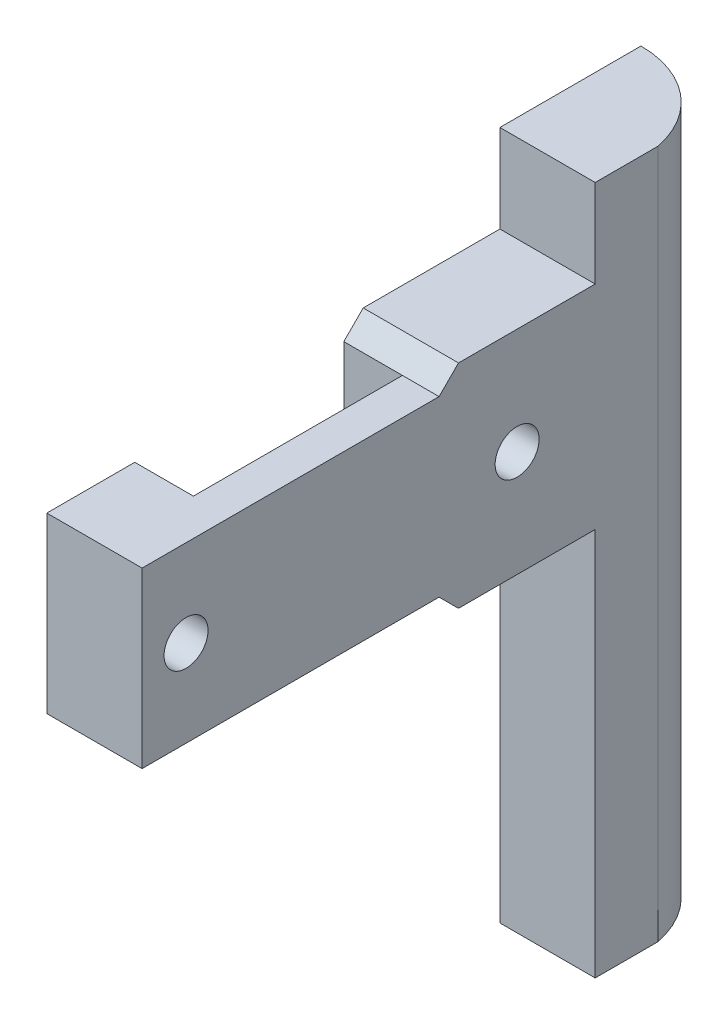
ISO-10303-21;
HEADER;
FILE_DESCRIPTION(('STEP AP214'),'2;1');
FILE_NAME('part.step','',(''),(''),'','','');
FILE_SCHEMA(('AUTOMOTIVE_DESIGN { 1 0 10303 214 1 1 1 1 }'));
ENDSEC;
DATA;
#1=APPLICATION_CONTEXT('core data for automotive mechanical design processes');
#2=APPLICATION_PROTOCOL_DEFINITION('international standard','automotive_design',2000,#1);
#3=PRODUCT_CONTEXT('',#1,'mechanical');
#4=PRODUCT('Part','Part','',(#3));
#5=PRODUCT_RELATED_PRODUCT_CATEGORY('part','',(#4));
#6=PRODUCT_DEFINITION_FORMATION('','',#4);
#7=PRODUCT_DEFINITION_CONTEXT('part definition',#1,'design');
#8=PRODUCT_DEFINITION('design','',#6,#7);
#9=PRODUCT_DEFINITION_SHAPE('','',#8);
#10=(LENGTH_UNIT() NAMED_UNIT(*) SI_UNIT(.MILLI.,.METRE.));
#11=(NAMED_UNIT(*) PLANE_ANGLE_UNIT() SI_UNIT($,.RADIAN.));
#12=(NAMED_UNIT(*) SI_UNIT($,.STERADIAN.) SOLID_ANGLE_UNIT());
#13=UNCERTAINTY_MEASURE_WITH_UNIT(LENGTH_MEASURE(1.E-05),#10,'distance_accuracy_value','');
#14=(GEOMETRIC_REPRESENTATION_CONTEXT(3) GLOBAL_UNCERTAINTY_ASSIGNED_CONTEXT((#13)) GLOBAL_UNIT_ASSIGNED_CONTEXT((#10,
#11,#12)) REPRESENTATION_CONTEXT('',''));
#15=CARTESIAN_POINT('',(0.,0.,0.));
#16=DIRECTION('',(0.,0.,1.));
#17=DIRECTION('',(1.,0.,0.));
#18=AXIS2_PLACEMENT_3D('',#15,#16,#17);
#19=CARTESIAN_POINT('',(12.87,26.5,-16.65));
#20=DIRECTION('',(0.,-1.,0.));
#21=DIRECTION('',(0.,0.,-1.));
#22=AXIS2_PLACEMENT_3D('',#19,#20,#21);
#23=CYLINDRICAL_SURFACE('',#22,13.25);
#24=CARTESIAN_POINT('',(12.87,-67.5,-16.65));
#25=DIRECTION('',(0.,-1.,0.));
#26=DIRECTION('',(0.,0.,-1.));
#27=AXIS2_PLACEMENT_3D('',#24,#25,#26);
#28=CIRCLE('',#27,13.25);
#29=CARTESIAN_POINT('',(12.87,-67.5,-29.9));
#30=VERTEX_POINT('',#29);
#31=CARTESIAN_POINT('',(25.87,-67.5,-19.2117376914899));
#32=VERTEX_POINT('',#31);
#33=EDGE_CURVE('E172',#30,#32,#28,.T.);
#34=ORIENTED_EDGE('',*,*,#33,.F.);
#35=DIRECTION('',(0.,1.,0.));
#36=VECTOR('',#35,1.);
#37=CARTESIAN_POINT('',(12.87,69.9983495705505,-29.9));
#38=LINE('',#37,#36);
#39=CARTESIAN_POINT('',(12.87,26.5,-29.9));
#40=VERTEX_POINT('',#39);
#41=EDGE_CURVE('E154',#30,#40,#38,.T.);
#42=ORIENTED_EDGE('',*,*,#41,.T.);
#43=CARTESIAN_POINT('',(12.87,26.5,-16.65));
#44=DIRECTION('',(0.,-1.,0.));
#45=DIRECTION('',(0.,0.,-1.));
#46=AXIS2_PLACEMENT_3D('',#43,#44,#45);
#47=CIRCLE('',#46,13.25);
#48=CARTESIAN_POINT('',(25.87,26.5,-19.2117376914899));
#49=VERTEX_POINT('',#48);
#50=EDGE_CURVE('E178',#40,#49,#47,.T.);
#51=ORIENTED_EDGE('',*,*,#50,.T.);
#52=DIRECTION('',(0.,-1.,0.));
#53=VECTOR('',#52,1.);
#54=CARTESIAN_POINT('',(25.87,26.5,-19.2117376914899));
#55=LINE('',#54,#53);
#56=EDGE_CURVE('E180',#49,#32,#55,.T.);
#57=ORIENTED_EDGE('',*,*,#56,.T.);
#58=EDGE_LOOP('',(#34,#42,#51,#57));
#59=FACE_BOUND('',#58,.T.);
#60=ADVANCED_FACE('F35',(#59),#23,.T.);
#61=CARTESIAN_POINT('',(25.87,0.,0.));
#62=DIRECTION('',(-1.,0.,0.));
#63=DIRECTION('',(0.,0.,1.));
#64=AXIS2_PLACEMENT_3D('',#61,#62,#63);
#65=PLANE('',#64);
#66=CARTESIAN_POINT('',(25.87,0.,45.17));
#67=DIRECTION('',(1.,0.,0.));
#68=DIRECTION('',(0.,0.,-1.));
#69=AXIS2_PLACEMENT_3D('',#66,#67,#68);
#70=CIRCLE('',#69,3.);
#71=CARTESIAN_POINT('',(25.87,0.,42.17));
#72=VERTEX_POINT('',#71);
#73=EDGE_CURVE('E272',#72,#72,#70,.T.);
#74=ORIENTED_EDGE('',*,*,#73,.F.);
#75=EDGE_LOOP('',(#74));
#76=FACE_BOUND('',#75,.T.);
#77=CARTESIAN_POINT('',(25.87,0.,0.));
#78=DIRECTION('',(1.,0.,0.));
#79=DIRECTION('',(0.,0.,-1.));
#80=AXIS2_PLACEMENT_3D('',#77,#78,#79);
#81=CIRCLE('',#80,3.);
#82=CARTESIAN_POINT('',(25.87,0.,-3.));
#83=VERTEX_POINT('',#82);
#84=EDGE_CURVE('E174',#83,#83,#81,.T.);
#85=ORIENTED_EDGE('',*,*,#84,.F.);
#86=EDGE_LOOP('',(#85));
#87=FACE_BOUND('',#86,.T.);
#88=ORIENTED_EDGE('',*,*,#56,.F.);
#89=DIRECTION('',(0.,0.,1.));
#90=VECTOR('',#89,1.);
#91=CARTESIAN_POINT('',(25.87,26.5,-30.65));
#92=LINE('',#91,#90);
#93=CARTESIAN_POINT('',(25.87,26.5,-10.65));
#94=VERTEX_POINT('',#93);
#95=EDGE_CURVE('E193',#49,#94,#92,.T.);
#96=ORIENTED_EDGE('',*,*,#95,.T.);
#97=DIRECTION('',(0.,-1.,0.));
#98=VECTOR('',#97,1.);
#99=CARTESIAN_POINT('',(25.87,26.5,-10.65));
#100=LINE('',#99,#98);
#101=CARTESIAN_POINT('',(25.87,14.5,-10.65));
#102=VERTEX_POINT('',#101);
#103=EDGE_CURVE('E185',#94,#102,#100,.T.);
#104=ORIENTED_EDGE('',*,*,#103,.T.);
#105=DIRECTION('',(0.,0.,1.));
#106=VECTOR('',#105,1.);
#107=CARTESIAN_POINT('',(25.87,14.5,-10.65));
#108=LINE('',#107,#106);
#109=CARTESIAN_POINT('',(25.87,14.5,7.99834957055046));
#110=VERTEX_POINT('',#109);
#111=EDGE_CURVE('E242',#102,#110,#108,.T.);
#112=ORIENTED_EDGE('',*,*,#111,.T.);
#113=DIRECTION('',(0.,-0.707106781186551,0.707106781186544));
#114=VECTOR('',#113,1.);
#115=CARTESIAN_POINT('',(25.87,14.5,7.99834957055046));
#116=LINE('',#115,#114);
#117=CARTESIAN_POINT('',(25.87,11.8483495705504,10.65));
#118=VERTEX_POINT('',#117);
#119=EDGE_CURVE('E230',#110,#118,#116,.T.);
#120=ORIENTED_EDGE('',*,*,#119,.T.);
#121=DIRECTION('',(0.,0.,-1.));
#122=VECTOR('',#121,1.);
#123=CARTESIAN_POINT('',(25.87,11.8483495705504,44.17));
#124=LINE('',#123,#122);
#125=CARTESIAN_POINT('',(25.87,11.8483495705504,51.17));
#126=VERTEX_POINT('',#125);
#127=EDGE_CURVE('E219',#126,#118,#124,.T.);
#128=ORIENTED_EDGE('',*,*,#127,.F.);
#129=DIRECTION('',(0.,1.,0.));
#130=VECTOR('',#129,1.);
#131=CARTESIAN_POINT('',(25.87,11.8483495705504,51.17));
#132=LINE('',#131,#130);
#133=CARTESIAN_POINT('',(25.87,-11.8516504294496,51.17));
#134=VERTEX_POINT('',#133);
#135=EDGE_CURVE('E169',#134,#126,#132,.T.);
#136=ORIENTED_EDGE('',*,*,#135,.F.);
#137=DIRECTION('',(0.,0.,-1.));
#138=VECTOR('',#137,1.);
#139=CARTESIAN_POINT('',(25.87,-11.8516504294496,44.17));
#140=LINE('',#139,#138);
#141=CARTESIAN_POINT('',(25.87,-11.8516504294496,10.65));
#142=VERTEX_POINT('',#141);
#143=EDGE_CURVE('E221',#134,#142,#140,.T.);
#144=ORIENTED_EDGE('',*,*,#143,.T.);
#145=DIRECTION('',(0.,1.,0.));
#146=VECTOR('',#145,1.);
#147=CARTESIAN_POINT('',(25.87,11.8483495705504,10.65));
#148=LINE('',#147,#146);
#149=CARTESIAN_POINT('',(25.87,-11.8483495705504,10.65));
#150=VERTEX_POINT('',#149);
#151=EDGE_CURVE('E210',#142,#150,#148,.T.);
#152=ORIENTED_EDGE('',*,*,#151,.T.);
#153=DIRECTION('',(0.,0.707106781186551,0.707106781186544));
#154=VECTOR('',#153,1.);
#155=CARTESIAN_POINT('',(25.87,-11.2491747852751,11.2491747852753));
#156=LINE('',#155,#154);
#157=CARTESIAN_POINT('',(25.87,-14.5,7.99834957055045));
#158=VERTEX_POINT('',#157);
#159=EDGE_CURVE('E227',#158,#150,#156,.T.);
#160=ORIENTED_EDGE('',*,*,#159,.F.);
#161=DIRECTION('',(0.,0.,-1.));
#162=VECTOR('',#161,1.);
#163=CARTESIAN_POINT('',(25.87,-14.5,-10.65));
#164=LINE('',#163,#162);
#165=CARTESIAN_POINT('',(25.87,-14.5,-10.65));
#166=VERTEX_POINT('',#165);
#167=EDGE_CURVE('E233',#158,#166,#164,.T.);
#168=ORIENTED_EDGE('',*,*,#167,.T.);
#169=CARTESIAN_POINT('',(25.87,-67.5,-10.65));
#170=VERTEX_POINT('',#169);
#171=EDGE_CURVE('E184',#166,#170,#100,.T.);
#172=ORIENTED_EDGE('',*,*,#171,.T.);
#173=DIRECTION('',(0.,0.,1.));
#174=VECTOR('',#173,1.);
#175=CARTESIAN_POINT('',(25.87,-67.5,-30.65));
#176=LINE('',#175,#174);
#177=EDGE_CURVE('E196',#32,#170,#176,.T.);
#178=ORIENTED_EDGE('',*,*,#177,.F.);
#179=EDGE_LOOP('',(#88,#96,#104,#112,#120,#128,#136,#144,#152,#160,#168,#172,#178));
#180=FACE_BOUND('',#179,.T.);
#181=ADVANCED_FACE('F260',(#76,#87,#180),#65,.F.);
#182=CARTESIAN_POINT('',(0.,-67.5,-30.65));
#183=DIRECTION('',(0.,1.,0.));
#184=DIRECTION('',(0.,0.,1.));
#185=AXIS2_PLACEMENT_3D('',#182,#183,#184);
#186=PLANE('',#185);
#187=DIRECTION('',(-1.,0.,0.));
#188=VECTOR('',#187,1.);
#189=CARTESIAN_POINT('',(0.,-67.5,-10.65));
#190=LINE('',#189,#188);
#191=CARTESIAN_POINT('',(12.87,-67.5,-10.65));
#192=VERTEX_POINT('',#191);
#193=EDGE_CURVE('E188',#170,#192,#190,.T.);
#194=ORIENTED_EDGE('',*,*,#193,.T.);
#195=DIRECTION('',(0.,0.,-1.));
#196=VECTOR('',#195,1.);
#197=CARTESIAN_POINT('',(12.87,-67.5,-30.65));
#198=LINE('',#197,#196);
#199=EDGE_CURVE('E334',#192,#30,#198,.T.);
#200=ORIENTED_EDGE('',*,*,#199,.T.);
#201=ORIENTED_EDGE('',*,*,#33,.T.);
#202=ORIENTED_EDGE('',*,*,#177,.T.);
#203=EDGE_LOOP('',(#194,#200,#201,#202));
#204=FACE_BOUND('',#203,.T.);
#205=ADVANCED_FACE('F280',(#204),#186,.F.);
#206=CARTESIAN_POINT('',(0.,26.5,-30.65));
#207=DIRECTION('',(0.,-1.,0.));
#208=DIRECTION('',(1.,0.,0.));
#209=AXIS2_PLACEMENT_3D('',#206,#207,#208);
#210=PLANE('',#209);
#211=ORIENTED_EDGE('',*,*,#50,.F.);
#212=DIRECTION('',(0.,0.,1.));
#213=VECTOR('',#212,1.);
#214=CARTESIAN_POINT('',(12.87,26.5,-30.65));
#215=LINE('',#214,#213);
#216=CARTESIAN_POINT('',(12.87,26.5,-10.65));
#217=VERTEX_POINT('',#216);
#218=EDGE_CURVE('E51',#40,#217,#215,.T.);
#219=ORIENTED_EDGE('',*,*,#218,.T.);
#220=DIRECTION('',(1.,0.,0.));
#221=VECTOR('',#220,1.);
#222=CARTESIAN_POINT('',(0.,26.5,-10.65));
#223=LINE('',#222,#221);
#224=EDGE_CURVE('E191',#217,#94,#223,.T.);
#225=ORIENTED_EDGE('',*,*,#224,.T.);
#226=ORIENTED_EDGE('',*,*,#95,.F.);
#227=EDGE_LOOP('',(#211,#219,#225,#226));
#228=FACE_BOUND('',#227,.T.);
#229=ADVANCED_FACE('F265',(#228),#210,.F.);
#230=CARTESIAN_POINT('',(20.87,11.8483495705504,44.17));
#231=DIRECTION('',(1.,0.,0.));
#232=DIRECTION('',(0.,1.,0.));
#233=AXIS2_PLACEMENT_3D('',#230,#231,#232);
#234=PLANE('',#233);
#235=DIRECTION('',(0.,-1.,0.));
#236=VECTOR('',#235,1.);
#237=CARTESIAN_POINT('',(20.87,11.8483495705504,39.17));
#238=LINE('',#237,#236);
#239=CARTESIAN_POINT('',(20.87,11.8483495705504,39.17));
#240=VERTEX_POINT('',#239);
#241=CARTESIAN_POINT('',(20.87,-11.8516504294496,39.17));
#242=VERTEX_POINT('',#241);
#243=EDGE_CURVE('E198',#240,#242,#238,.T.);
#244=ORIENTED_EDGE('',*,*,#243,.F.);
#245=DIRECTION('',(0.,0.,-1.));
#246=VECTOR('',#245,1.);
#247=CARTESIAN_POINT('',(20.87,11.8483495705504,44.17));
#248=LINE('',#247,#246);
#249=CARTESIAN_POINT('',(20.87,11.8483495705504,10.65));
#250=VERTEX_POINT('',#249);
#251=EDGE_CURVE('E216',#240,#250,#248,.T.);
#252=ORIENTED_EDGE('',*,*,#251,.T.);
#253=DIRECTION('',(0.,-1.,0.));
#254=VECTOR('',#253,1.);
#255=CARTESIAN_POINT('',(20.87,11.8483495705504,10.65));
#256=LINE('',#255,#254);
#257=CARTESIAN_POINT('',(20.87,-11.8483495705504,10.65));
#258=VERTEX_POINT('',#257);
#259=EDGE_CURVE('E205',#250,#258,#256,.T.);
#260=ORIENTED_EDGE('',*,*,#259,.T.);
#261=CARTESIAN_POINT('',(20.87,-11.8516504294496,10.65));
#262=VERTEX_POINT('',#261);
#263=EDGE_CURVE('E204',#258,#262,#256,.T.);
#264=ORIENTED_EDGE('',*,*,#263,.T.);
#265=DIRECTION('',(0.,0.,-1.));
#266=VECTOR('',#265,1.);
#267=CARTESIAN_POINT('',(20.87,-11.8516504294496,44.17));
#268=LINE('',#267,#266);
#269=EDGE_CURVE('E224',#242,#262,#268,.T.);
#270=ORIENTED_EDGE('',*,*,#269,.F.);
#271=EDGE_LOOP('',(#244,#252,#260,#264,#270));
#272=FACE_BOUND('',#271,.T.);
#273=ADVANCED_FACE('F372',(#272),#234,.F.);
#274=CARTESIAN_POINT('',(25.87,14.5,10.65));
#275=DIRECTION('',(0.,0.,-1.));
#276=DIRECTION('',(0.,1.,0.));
#277=AXIS2_PLACEMENT_3D('',#274,#275,#276);
#278=PLANE('',#277);
#279=DIRECTION('',(1.,0.,0.));
#280=VECTOR('',#279,1.);
#281=CARTESIAN_POINT('',(0.,11.8483495705504,10.65));
#282=LINE('',#281,#280);
#283=CARTESIAN_POINT('',(12.87,11.8483495705504,10.65));
#284=VERTEX_POINT('',#283);
#285=EDGE_CURVE('E226',#284,#250,#282,.T.);
#286=ORIENTED_EDGE('',*,*,#285,.F.);
#287=DIRECTION('',(0.,-1.,0.));
#288=VECTOR('',#287,1.);
#289=CARTESIAN_POINT('',(12.87,14.5,10.65));
#290=LINE('',#289,#288);
#291=CARTESIAN_POINT('',(12.87,-11.8483495705504,10.65));
#292=VERTEX_POINT('',#291);
#293=EDGE_CURVE('E329',#284,#292,#290,.T.);
#294=ORIENTED_EDGE('',*,*,#293,.T.);
#295=DIRECTION('',(1.,0.,0.));
#296=VECTOR('',#295,1.);
#297=CARTESIAN_POINT('',(0.,-11.8483495705504,10.65));
#298=LINE('',#297,#296);
#299=EDGE_CURVE('E231',#292,#258,#298,.T.);
#300=ORIENTED_EDGE('',*,*,#299,.T.);
#301=ORIENTED_EDGE('',*,*,#259,.F.);
#302=EDGE_LOOP('',(#286,#294,#300,#301));
#303=FACE_BOUND('',#302,.T.);
#304=ADVANCED_FACE('F37',(#303),#278,.F.);
#305=CARTESIAN_POINT('',(25.87,14.5,-10.65));
#306=DIRECTION('',(0.,-1.,0.));
#307=DIRECTION('',(0.,0.,-1.));
#308=AXIS2_PLACEMENT_3D('',#305,#306,#307);
#309=PLANE('',#308);
#310=DIRECTION('',(-1.,0.,0.));
#311=VECTOR('',#310,1.);
#312=CARTESIAN_POINT('',(25.87,14.5,-10.65));
#313=LINE('',#312,#311);
#314=CARTESIAN_POINT('',(12.87,14.5,-10.65));
#315=VERTEX_POINT('',#314);
#316=EDGE_CURVE('E44',#102,#315,#313,.T.);
#317=ORIENTED_EDGE('',*,*,#316,.T.);
#318=DIRECTION('',(0.,0.,1.));
#319=VECTOR('',#318,1.);
#320=CARTESIAN_POINT('',(12.87,14.5,-10.65));
#321=LINE('',#320,#319);
#322=CARTESIAN_POINT('',(12.87,14.5,7.99834957055046));
#323=VERTEX_POINT('',#322);
#324=EDGE_CURVE('E250',#315,#323,#321,.T.);
#325=ORIENTED_EDGE('',*,*,#324,.T.);
#326=DIRECTION('',(1.,0.,0.));
#327=VECTOR('',#326,1.);
#328=CARTESIAN_POINT('',(0.,14.5,7.99834957055046));
#329=LINE('',#328,#327);
#330=EDGE_CURVE('E237',#323,#110,#329,.T.);
#331=ORIENTED_EDGE('',*,*,#330,.T.);
#332=ORIENTED_EDGE('',*,*,#111,.F.);
#333=EDGE_LOOP('',(#317,#325,#331,#332));
#334=FACE_BOUND('',#333,.T.);
#335=ADVANCED_FACE('F249',(#334),#309,.F.);
#336=CARTESIAN_POINT('',(25.87,-14.5,-10.65));
#337=DIRECTION('',(0.,1.,0.));
#338=DIRECTION('',(0.,0.,1.));
#339=AXIS2_PLACEMENT_3D('',#336,#337,#338);
#340=PLANE('',#339);
#341=DIRECTION('',(1.,0.,0.));
#342=VECTOR('',#341,1.);
#343=CARTESIAN_POINT('',(0.,-14.5,7.99834957055045));
#344=LINE('',#343,#342);
#345=CARTESIAN_POINT('',(12.87,-14.5,7.99834957055044));
#346=VERTEX_POINT('',#345);
#347=EDGE_CURVE('E229',#346,#158,#344,.T.);
#348=ORIENTED_EDGE('',*,*,#347,.F.);
#349=DIRECTION('',(0.,0.,-1.));
#350=VECTOR('',#349,1.);
#351=CARTESIAN_POINT('',(12.87,-14.5,-10.65));
#352=LINE('',#351,#350);
#353=CARTESIAN_POINT('',(12.87,-14.5,-10.65));
#354=VERTEX_POINT('',#353);
#355=EDGE_CURVE('E309',#346,#354,#352,.T.);
#356=ORIENTED_EDGE('',*,*,#355,.T.);
#357=DIRECTION('',(-1.,0.,0.));
#358=VECTOR('',#357,1.);
#359=CARTESIAN_POINT('',(25.87,-14.5,-10.65));
#360=LINE('',#359,#358);
#361=EDGE_CURVE('E11',#166,#354,#360,.T.);
#362=ORIENTED_EDGE('',*,*,#361,.F.);
#363=ORIENTED_EDGE('',*,*,#167,.F.);
#364=EDGE_LOOP('',(#348,#356,#362,#363));
#365=FACE_BOUND('',#364,.T.);
#366=ADVANCED_FACE('F297',(#365),#340,.F.);
#367=CARTESIAN_POINT('',(0.,14.5,7.99834957055046));
#368=DIRECTION('',(0.,0.707106781186544,0.707106781186551));
#369=DIRECTION('',(0.,-0.707106781186551,0.707106781186544));
#370=AXIS2_PLACEMENT_3D('',#367,#368,#369);
#371=PLANE('',#370);
#372=DIRECTION('',(0.,0.707106781186551,-0.707106781186544));
#373=VECTOR('',#372,1.);
#374=CARTESIAN_POINT('',(12.87,14.5,7.99834957055046));
#375=LINE('',#374,#373);
#376=EDGE_CURVE('E331',#284,#323,#375,.T.);
#377=ORIENTED_EDGE('',*,*,#376,.F.);
#378=ORIENTED_EDGE('',*,*,#285,.T.);
#379=DIRECTION('',(-1.,0.,0.));
#380=VECTOR('',#379,1.);
#381=CARTESIAN_POINT('',(25.87,11.8483495705504,10.65));
#382=LINE('',#381,#380);
#383=EDGE_CURVE('E213',#118,#250,#382,.T.);
#384=ORIENTED_EDGE('',*,*,#383,.F.);
#385=ORIENTED_EDGE('',*,*,#119,.F.);
#386=ORIENTED_EDGE('',*,*,#330,.F.);
#387=EDGE_LOOP('',(#377,#378,#384,#385,#386));
#388=FACE_BOUND('',#387,.T.);
#389=ADVANCED_FACE('F294',(#388),#371,.T.);
#390=CARTESIAN_POINT('',(0.,-11.2491747852751,11.2491747852753));
#391=DIRECTION('',(0.,0.707106781186544,-0.707106781186551));
#392=DIRECTION('',(0.,0.707106781186551,0.707106781186544));
#393=AXIS2_PLACEMENT_3D('',#390,#391,#392);
#394=PLANE('',#393);
#395=ORIENTED_EDGE('',*,*,#299,.F.);
#396=DIRECTION('',(0.,-0.707106781186551,-0.707106781186544));
#397=VECTOR('',#396,1.);
#398=CARTESIAN_POINT('',(12.87,-11.2491747852751,11.2491747852753));
#399=LINE('',#398,#397);
#400=EDGE_CURVE('E316',#292,#346,#399,.T.);
#401=ORIENTED_EDGE('',*,*,#400,.T.);
#402=ORIENTED_EDGE('',*,*,#347,.T.);
#403=ORIENTED_EDGE('',*,*,#159,.T.);
#404=EDGE_CURVE('E234',#258,#150,#298,.T.);
#405=ORIENTED_EDGE('',*,*,#404,.F.);
#406=EDGE_LOOP('',(#395,#401,#402,#403,#405));
#407=FACE_BOUND('',#406,.T.);
#408=ADVANCED_FACE('F303',(#407),#394,.F.);
#409=CARTESIAN_POINT('',(25.87,-11.8516504294496,44.17));
#410=DIRECTION('',(0.,1.,0.));
#411=DIRECTION('',(0.,0.,1.));
#412=AXIS2_PLACEMENT_3D('',#409,#410,#411);
#413=PLANE('',#412);
#414=DIRECTION('',(1.,0.,0.));
#415=VECTOR('',#414,1.);
#416=CARTESIAN_POINT('',(25.87,-11.8516504294496,51.17));
#417=LINE('',#416,#415);
#418=CARTESIAN_POINT('',(12.87,-11.8516504294496,51.17));
#419=VERTEX_POINT('',#418);
#420=EDGE_CURVE('E170',#419,#134,#417,.T.);
#421=ORIENTED_EDGE('',*,*,#420,.F.);
#422=DIRECTION('',(0.,0.,-1.));
#423=VECTOR('',#422,1.);
#424=CARTESIAN_POINT('',(12.87,-11.8516504294496,44.17));
#425=LINE('',#424,#423);
#426=CARTESIAN_POINT('',(12.87,-11.8516504294496,39.17));
#427=VERTEX_POINT('',#426);
#428=EDGE_CURVE('E59',#419,#427,#425,.T.);
#429=ORIENTED_EDGE('',*,*,#428,.T.);
#430=DIRECTION('',(1.,0.,0.));
#431=VECTOR('',#430,1.);
#432=CARTESIAN_POINT('',(4.97000000000001,-11.8516504294496,39.17));
#433=LINE('',#432,#431);
#434=EDGE_CURVE('E202',#427,#242,#433,.T.);
#435=ORIENTED_EDGE('',*,*,#434,.T.);
#436=ORIENTED_EDGE('',*,*,#269,.T.);
#437=DIRECTION('',(1.,0.,0.));
#438=VECTOR('',#437,1.);
#439=CARTESIAN_POINT('',(25.87,-11.8516504294496,10.65));
#440=LINE('',#439,#438);
#441=EDGE_CURVE('E208',#262,#142,#440,.T.);
#442=ORIENTED_EDGE('',*,*,#441,.T.);
#443=ORIENTED_EDGE('',*,*,#143,.F.);
#444=EDGE_LOOP('',(#421,#429,#435,#436,#442,#443));
#445=FACE_BOUND('',#444,.T.);
#446=ADVANCED_FACE('F382',(#445),#413,.F.);
#447=CARTESIAN_POINT('',(25.87,11.8483495705504,44.17));
#448=DIRECTION('',(0.,-1.,0.));
#449=DIRECTION('',(0.,0.,-1.));
#450=AXIS2_PLACEMENT_3D('',#447,#448,#449);
#451=PLANE('',#450);
#452=DIRECTION('',(1.,0.,0.));
#453=VECTOR('',#452,1.);
#454=CARTESIAN_POINT('',(4.97,11.8483495705504,39.17));
#455=LINE('',#454,#453);
#456=CARTESIAN_POINT('',(12.87,11.8483495705504,39.17));
#457=VERTEX_POINT('',#456);
#458=EDGE_CURVE('E164',#457,#240,#455,.T.);
#459=ORIENTED_EDGE('',*,*,#458,.F.);
#460=DIRECTION('',(0.,0.,1.));
#461=VECTOR('',#460,1.);
#462=CARTESIAN_POINT('',(12.87,11.8483495705504,44.17));
#463=LINE('',#462,#461);
#464=CARTESIAN_POINT('',(12.87,11.8483495705504,51.17));
#465=VERTEX_POINT('',#464);
#466=EDGE_CURVE('E149',#457,#465,#463,.T.);
#467=ORIENTED_EDGE('',*,*,#466,.T.);
#468=DIRECTION('',(-1.,0.,0.));
#469=VECTOR('',#468,1.);
#470=CARTESIAN_POINT('',(25.87,11.8483495705504,51.17));
#471=LINE('',#470,#469);
#472=EDGE_CURVE('E161',#126,#465,#471,.T.);
#473=ORIENTED_EDGE('',*,*,#472,.F.);
#474=ORIENTED_EDGE('',*,*,#127,.T.);
#475=ORIENTED_EDGE('',*,*,#383,.T.);
#476=ORIENTED_EDGE('',*,*,#251,.F.);
#477=EDGE_LOOP('',(#459,#467,#473,#474,#475,#476));
#478=FACE_BOUND('',#477,.T.);
#479=ADVANCED_FACE('F159',(#478),#451,.F.);
#480=CARTESIAN_POINT('',(0.,0.,10.65));
#481=DIRECTION('',(0.,0.,-1.));
#482=DIRECTION('',(-1.,0.,0.));
#483=AXIS2_PLACEMENT_3D('',#480,#481,#482);
#484=PLANE('',#483);
#485=ORIENTED_EDGE('',*,*,#263,.F.);
#486=ORIENTED_EDGE('',*,*,#404,.T.);
#487=ORIENTED_EDGE('',*,*,#151,.F.);
#488=ORIENTED_EDGE('',*,*,#441,.F.);
#489=EDGE_LOOP('',(#485,#486,#487,#488));
#490=FACE_BOUND('',#489,.T.);
#491=ADVANCED_FACE('F323',(#490),#484,.T.);
#492=CARTESIAN_POINT('',(4.97,11.8483495705504,39.17));
#493=DIRECTION('',(0.,0.,1.));
#494=DIRECTION('',(1.,0.,0.));
#495=AXIS2_PLACEMENT_3D('',#492,#493,#494);
#496=PLANE('',#495);
#497=ORIENTED_EDGE('',*,*,#434,.F.);
#498=DIRECTION('',(0.,1.,0.));
#499=VECTOR('',#498,1.);
#500=CARTESIAN_POINT('',(12.87,11.8483495705504,39.17));
#501=LINE('',#500,#499);
#502=EDGE_CURVE('E165',#427,#457,#501,.T.);
#503=ORIENTED_EDGE('',*,*,#502,.T.);
#504=ORIENTED_EDGE('',*,*,#458,.T.);
#505=ORIENTED_EDGE('',*,*,#243,.T.);
#506=EDGE_LOOP('',(#497,#503,#504,#505));
#507=FACE_BOUND('',#506,.T.);
#508=ADVANCED_FACE('F374',(#507),#496,.F.);
#509=CARTESIAN_POINT('',(0.,0.,-10.65));
#510=DIRECTION('',(0.,0.,1.));
#511=DIRECTION('',(0.,-1.,0.));
#512=AXIS2_PLACEMENT_3D('',#509,#510,#511);
#513=PLANE('',#512);
#514=DIRECTION('',(0.,1.,0.));
#515=VECTOR('',#514,1.);
#516=CARTESIAN_POINT('',(12.87,0.,-10.65));
#517=LINE('',#516,#515);
#518=EDGE_CURVE('E257',#315,#217,#517,.T.);
#519=ORIENTED_EDGE('',*,*,#518,.F.);
#520=ORIENTED_EDGE('',*,*,#316,.F.);
#521=ORIENTED_EDGE('',*,*,#103,.F.);
#522=ORIENTED_EDGE('',*,*,#224,.F.);
#523=EDGE_LOOP('',(#519,#520,#521,#522));
#524=FACE_BOUND('',#523,.T.);
#525=ADVANCED_FACE('F255',(#524),#513,.T.);
#526=DIRECTION('',(0.,1.,0.));
#527=VECTOR('',#526,1.);
#528=CARTESIAN_POINT('',(12.87,0.,-10.65));
#529=LINE('',#528,#527);
#530=EDGE_CURVE('E340',#192,#354,#529,.T.);
#531=ORIENTED_EDGE('',*,*,#530,.F.);
#532=ORIENTED_EDGE('',*,*,#193,.F.);
#533=ORIENTED_EDGE('',*,*,#171,.F.);
#534=ORIENTED_EDGE('',*,*,#361,.T.);
#535=EDGE_LOOP('',(#531,#532,#533,#534));
#536=FACE_BOUND('',#535,.T.);
#537=ADVANCED_FACE('F366',(#536),#513,.T.);
#538=CARTESIAN_POINT('',(0.,0.,51.17));
#539=DIRECTION('',(0.,0.,-1.));
#540=DIRECTION('',(-1.,0.,0.));
#541=AXIS2_PLACEMENT_3D('',#538,#539,#540);
#542=PLANE('',#541);
#543=ORIENTED_EDGE('',*,*,#472,.T.);
#544=DIRECTION('',(0.,1.,0.));
#545=VECTOR('',#544,1.);
#546=CARTESIAN_POINT('',(12.87,69.9983495705505,51.17));
#547=LINE('',#546,#545);
#548=EDGE_CURVE('E146',#419,#465,#547,.T.);
#549=ORIENTED_EDGE('',*,*,#548,.F.);
#550=ORIENTED_EDGE('',*,*,#420,.T.);
#551=ORIENTED_EDGE('',*,*,#135,.T.);
#552=EDGE_LOOP('',(#543,#549,#550,#551));
#553=FACE_BOUND('',#552,.T.);
#554=ADVANCED_FACE('F167',(#553),#542,.F.);
#555=CARTESIAN_POINT('',(25.87,0.,0.));
#556=DIRECTION('',(1.,0.,0.));
#557=DIRECTION('',(0.,0.,-1.));
#558=AXIS2_PLACEMENT_3D('',#555,#556,#557);
#559=CYLINDRICAL_SURFACE('',#558,3.);
#560=CARTESIAN_POINT('',(12.87,0.,0.));
#561=DIRECTION('',(1.,0.,0.));
#562=DIRECTION('',(0.,1.,0.));
#563=AXIS2_PLACEMENT_3D('',#560,#561,#562);
#564=CIRCLE('',#563,3.);
#565=CARTESIAN_POINT('',(12.87,3.,0.));
#566=VERTEX_POINT('',#565);
#567=EDGE_CURVE('E342',#566,#566,#564,.F.);
#568=ORIENTED_EDGE('',*,*,#567,.T.);
#569=EDGE_LOOP('',(#568));
#570=FACE_BOUND('',#569,.T.);
#571=ORIENTED_EDGE('',*,*,#84,.T.);
#572=EDGE_LOOP('',(#571));
#573=FACE_BOUND('',#572,.T.);
#574=ADVANCED_FACE('F277',(#570,#573),#559,.F.);
#575=CARTESIAN_POINT('',(25.87,0.,45.17));
#576=DIRECTION('',(1.,0.,0.));
#577=DIRECTION('',(0.,0.,-1.));
#578=AXIS2_PLACEMENT_3D('',#575,#576,#577);
#579=CYLINDRICAL_SURFACE('',#578,3.);
#580=CARTESIAN_POINT('',(12.87,0.,45.17));
#581=DIRECTION('',(1.,0.,0.));
#582=DIRECTION('',(0.,1.,0.));
#583=AXIS2_PLACEMENT_3D('',#580,#581,#582);
#584=CIRCLE('',#583,3.);
#585=CARTESIAN_POINT('',(12.87,3.,45.17));
#586=VERTEX_POINT('',#585);
#587=EDGE_CURVE('E39',#586,#586,#584,.F.);
#588=ORIENTED_EDGE('',*,*,#587,.T.);
#589=EDGE_LOOP('',(#588));
#590=FACE_BOUND('',#589,.T.);
#591=ORIENTED_EDGE('',*,*,#73,.T.);
#592=EDGE_LOOP('',(#591));
#593=FACE_BOUND('',#592,.T.);
#594=ADVANCED_FACE('F349',(#590,#593),#579,.F.);
#595=CARTESIAN_POINT('',(12.87,69.9983495705505,-29.9));
#596=DIRECTION('',(1.,0.,0.));
#597=DIRECTION('',(0.,1.,0.));
#598=AXIS2_PLACEMENT_3D('',#595,#596,#597);
#599=PLANE('',#598);
#600=ORIENTED_EDGE('',*,*,#587,.F.);
#601=EDGE_LOOP('',(#600));
#602=FACE_BOUND('',#601,.T.);
#603=ORIENTED_EDGE('',*,*,#548,.T.);
#604=ORIENTED_EDGE('',*,*,#466,.F.);
#605=ORIENTED_EDGE('',*,*,#502,.F.);
#606=ORIENTED_EDGE('',*,*,#428,.F.);
#607=EDGE_LOOP('',(#603,#604,#605,#606));
#608=FACE_BOUND('',#607,.T.);
#609=ADVANCED_FACE('F148',(#602,#608),#599,.F.);
#610=ORIENTED_EDGE('',*,*,#567,.F.);
#611=EDGE_LOOP('',(#610));
#612=FACE_BOUND('',#611,.T.);
#613=ORIENTED_EDGE('',*,*,#41,.F.);
#614=ORIENTED_EDGE('',*,*,#199,.F.);
#615=ORIENTED_EDGE('',*,*,#530,.T.);
#616=ORIENTED_EDGE('',*,*,#355,.F.);
#617=ORIENTED_EDGE('',*,*,#400,.F.);
#618=ORIENTED_EDGE('',*,*,#293,.F.);
#619=ORIENTED_EDGE('',*,*,#376,.T.);
#620=ORIENTED_EDGE('',*,*,#324,.F.);
#621=ORIENTED_EDGE('',*,*,#518,.T.);
#622=ORIENTED_EDGE('',*,*,#218,.F.);
#623=EDGE_LOOP('',(#613,#614,#615,#616,#617,#618,#619,#620,#621,#622));
#624=FACE_BOUND('',#623,.T.);
#625=ADVANCED_FACE('F353',(#612,#624),#599,.F.);
#626=CLOSED_SHELL('',(#60,#181,#205,#229,#273,#304,#335,#366,#389,#408,#446,#479,#491,#508,#525,
#537,#554,#574,#594,#609,#625));
#627=MANIFOLD_SOLID_BREP('B2',#626);
#628=ADVANCED_BREP_SHAPE_REPRESENTATION('',(#18,#627),#14);
#629=SHAPE_DEFINITION_REPRESENTATION(#9,#628);
ENDSEC;
END-ISO-10303-21;
